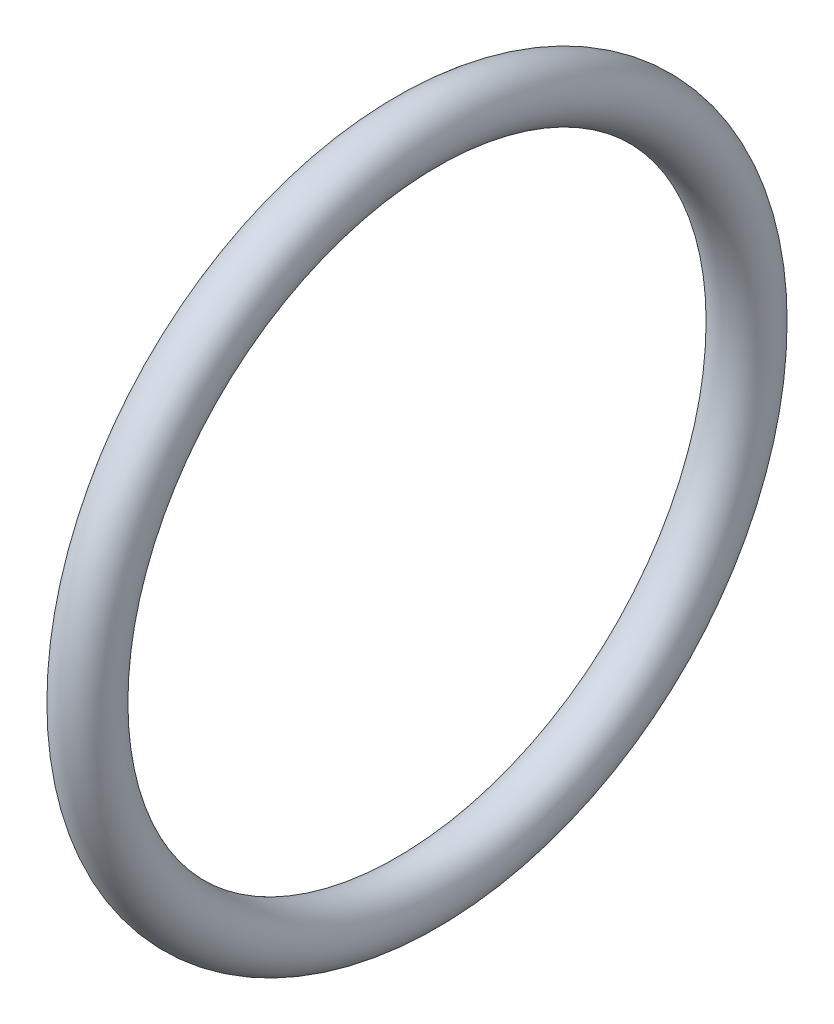
ISO-10303-21;
HEADER;
FILE_DESCRIPTION(('STEP AP214'),'2;1');
FILE_NAME('part.step','',(''),(''),'','','');
FILE_SCHEMA(('AUTOMOTIVE_DESIGN { 1 0 10303 214 1 1 1 1 }'));
ENDSEC;
DATA;
#1=APPLICATION_CONTEXT('core data for automotive mechanical design processes');
#2=APPLICATION_PROTOCOL_DEFINITION('international standard','automotive_design',2000,#1);
#3=PRODUCT_CONTEXT('',#1,'mechanical');
#4=PRODUCT('Part','Part','',(#3));
#5=PRODUCT_RELATED_PRODUCT_CATEGORY('part','',(#4));
#6=PRODUCT_DEFINITION_FORMATION('','',#4);
#7=PRODUCT_DEFINITION_CONTEXT('part definition',#1,'design');
#8=PRODUCT_DEFINITION('design','',#6,#7);
#9=PRODUCT_DEFINITION_SHAPE('','',#8);
#10=(LENGTH_UNIT() NAMED_UNIT(*) SI_UNIT(.MILLI.,.METRE.));
#11=(NAMED_UNIT(*) PLANE_ANGLE_UNIT() SI_UNIT($,.RADIAN.));
#12=(NAMED_UNIT(*) SI_UNIT($,.STERADIAN.) SOLID_ANGLE_UNIT());
#13=UNCERTAINTY_MEASURE_WITH_UNIT(LENGTH_MEASURE(1.E-05),#10,'distance_accuracy_value','');
#14=(GEOMETRIC_REPRESENTATION_CONTEXT(3) GLOBAL_UNCERTAINTY_ASSIGNED_CONTEXT((#13)) GLOBAL_UNIT_ASSIGNED_CONTEXT((#10,
#11,#12)) REPRESENTATION_CONTEXT('',''));
#15=CARTESIAN_POINT('',(0.,0.,0.));
#16=DIRECTION('',(0.,0.,1.));
#17=DIRECTION('',(1.,0.,0.));
#18=AXIS2_PLACEMENT_3D('',#15,#16,#17);
#19=CARTESIAN_POINT('',(0.,-23.,0.));
#20=DIRECTION('',(-1.,0.,0.));
#21=DIRECTION('',(0.,0.,1.));
#22=AXIS2_PLACEMENT_3D('',#19,#20,#21);
#23=TOROIDAL_SURFACE('',#22,23.,2.);
#24=CARTESIAN_POINT('',(0.,-23.,25.));
#25=VERTEX_POINT('',#24);
#26=VERTEX_LOOP('',#25);
#27=FACE_BOUND('',#26,.T.);
#28=ADVANCED_FACE('F29',(#27),#23,.T.);
#29=CLOSED_SHELL('',(#28));
#30=MANIFOLD_SOLID_BREP('B2',#29);
#31=ADVANCED_BREP_SHAPE_REPRESENTATION('',(#18,#30),#14);
#32=SHAPE_DEFINITION_REPRESENTATION(#9,#31);
ENDSEC;
END-ISO-10303-21;
